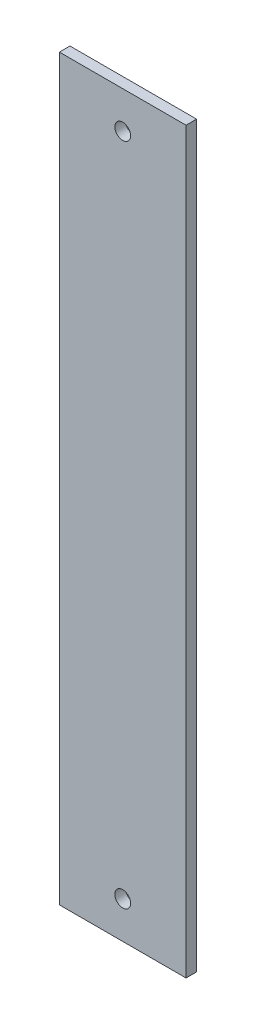
ISO-10303-21;
HEADER;
FILE_DESCRIPTION(('STEP AP214'),'2;1');
FILE_NAME('part.step','',(''),(''),'','','');
FILE_SCHEMA(('AUTOMOTIVE_DESIGN { 1 0 10303 214 1 1 1 1 }'));
ENDSEC;
DATA;
#1=APPLICATION_CONTEXT('core data for automotive mechanical design processes');
#2=APPLICATION_PROTOCOL_DEFINITION('international standard','automotive_design',2000,#1);
#3=PRODUCT_CONTEXT('',#1,'mechanical');
#4=PRODUCT('Part','Part','',(#3));
#5=PRODUCT_RELATED_PRODUCT_CATEGORY('part','',(#4));
#6=PRODUCT_DEFINITION_FORMATION('','',#4);
#7=PRODUCT_DEFINITION_CONTEXT('part definition',#1,'design');
#8=PRODUCT_DEFINITION('design','',#6,#7);
#9=PRODUCT_DEFINITION_SHAPE('','',#8);
#10=(LENGTH_UNIT() NAMED_UNIT(*) SI_UNIT(.MILLI.,.METRE.));
#11=(NAMED_UNIT(*) PLANE_ANGLE_UNIT() SI_UNIT($,.RADIAN.));
#12=(NAMED_UNIT(*) SI_UNIT($,.STERADIAN.) SOLID_ANGLE_UNIT());
#13=UNCERTAINTY_MEASURE_WITH_UNIT(LENGTH_MEASURE(1.E-05),#10,'distance_accuracy_value','');
#14=(GEOMETRIC_REPRESENTATION_CONTEXT(3) GLOBAL_UNCERTAINTY_ASSIGNED_CONTEXT((#13)) GLOBAL_UNIT_ASSIGNED_CONTEXT((#10,
#11,#12)) REPRESENTATION_CONTEXT('',''));
#15=CARTESIAN_POINT('',(0.,0.,0.));
#16=DIRECTION('',(0.,0.,1.));
#17=DIRECTION('',(1.,0.,0.));
#18=AXIS2_PLACEMENT_3D('',#15,#16,#17);
#19=CARTESIAN_POINT('',(0.,0.,2.));
#20=DIRECTION('',(0.,0.,-1.));
#21=DIRECTION('',(-1.,0.,0.));
#22=AXIS2_PLACEMENT_3D('',#19,#20,#21);
#23=PLANE('',#22);
#24=DIRECTION('',(0.,-1.,0.));
#25=VECTOR('',#24,1.);
#26=CARTESIAN_POINT('',(0.,0.,2.));
#27=LINE('',#26,#25);
#28=CARTESIAN_POINT('',(0.,140.,2.));
#29=VERTEX_POINT('',#28);
#30=CARTESIAN_POINT('',(0.,0.,2.));
#31=VERTEX_POINT('',#30);
#32=EDGE_CURVE('E87',#29,#31,#27,.T.);
#33=ORIENTED_EDGE('',*,*,#32,.T.);
#34=DIRECTION('',(1.,0.,0.));
#35=VECTOR('',#34,1.);
#36=CARTESIAN_POINT('',(0.,0.,2.));
#37=LINE('',#36,#35);
#38=CARTESIAN_POINT('',(24.,0.,2.));
#39=VERTEX_POINT('',#38);
#40=EDGE_CURVE('E82',#31,#39,#37,.T.);
#41=ORIENTED_EDGE('',*,*,#40,.T.);
#42=DIRECTION('',(0.,1.,0.));
#43=VECTOR('',#42,1.);
#44=CARTESIAN_POINT('',(24.,0.,2.));
#45=LINE('',#44,#43);
#46=CARTESIAN_POINT('',(24.,140.,2.));
#47=VERTEX_POINT('',#46);
#48=EDGE_CURVE('E85',#39,#47,#45,.T.);
#49=ORIENTED_EDGE('',*,*,#48,.T.);
#50=DIRECTION('',(-1.,0.,0.));
#51=VECTOR('',#50,1.);
#52=CARTESIAN_POINT('',(0.,140.,2.));
#53=LINE('',#52,#51);
#54=EDGE_CURVE('E52',#47,#29,#53,.T.);
#55=ORIENTED_EDGE('',*,*,#54,.T.);
#56=EDGE_LOOP('',(#33,#41,#49,#55));
#57=FACE_BOUND('',#56,.T.);
#58=CARTESIAN_POINT('',(12.,133.,2.));
#59=DIRECTION('',(0.,0.,1.));
#60=DIRECTION('',(1.,0.,0.));
#61=AXIS2_PLACEMENT_3D('',#58,#59,#60);
#62=CIRCLE('',#61,1.5);
#63=CARTESIAN_POINT('',(13.5,133.,2.));
#64=VERTEX_POINT('',#63);
#65=EDGE_CURVE('E102',#64,#64,#62,.T.);
#66=ORIENTED_EDGE('',*,*,#65,.F.);
#67=EDGE_LOOP('',(#66));
#68=FACE_BOUND('',#67,.T.);
#69=CARTESIAN_POINT('',(12.,7.,2.));
#70=DIRECTION('',(0.,0.,1.));
#71=DIRECTION('',(1.,0.,0.));
#72=AXIS2_PLACEMENT_3D('',#69,#70,#71);
#73=CIRCLE('',#72,1.5);
#74=CARTESIAN_POINT('',(13.5,7.,2.));
#75=VERTEX_POINT('',#74);
#76=EDGE_CURVE('E117',#75,#75,#73,.T.);
#77=ORIENTED_EDGE('',*,*,#76,.F.);
#78=EDGE_LOOP('',(#77));
#79=FACE_BOUND('',#78,.T.);
#80=ADVANCED_FACE('F35',(#57,#68,#79),#23,.F.);
#81=CARTESIAN_POINT('',(0.,0.,0.));
#82=DIRECTION('',(0.,0.,-1.));
#83=DIRECTION('',(-1.,0.,0.));
#84=AXIS2_PLACEMENT_3D('',#81,#82,#83);
#85=PLANE('',#84);
#86=CARTESIAN_POINT('',(12.,133.,0.));
#87=DIRECTION('',(0.,0.,1.));
#88=DIRECTION('',(1.,0.,0.));
#89=AXIS2_PLACEMENT_3D('',#86,#87,#88);
#90=CIRCLE('',#89,1.5);
#91=CARTESIAN_POINT('',(13.5,133.,0.));
#92=VERTEX_POINT('',#91);
#93=EDGE_CURVE('E114',#92,#92,#90,.T.);
#94=ORIENTED_EDGE('',*,*,#93,.T.);
#95=EDGE_LOOP('',(#94));
#96=FACE_BOUND('',#95,.T.);
#97=DIRECTION('',(0.,-1.,0.));
#98=VECTOR('',#97,1.);
#99=CARTESIAN_POINT('',(0.,0.,0.));
#100=LINE('',#99,#98);
#101=CARTESIAN_POINT('',(0.,140.,0.));
#102=VERTEX_POINT('',#101);
#103=CARTESIAN_POINT('',(0.,0.,0.));
#104=VERTEX_POINT('',#103);
#105=EDGE_CURVE('E99',#102,#104,#100,.T.);
#106=ORIENTED_EDGE('',*,*,#105,.F.);
#107=DIRECTION('',(-1.,0.,0.));
#108=VECTOR('',#107,1.);
#109=CARTESIAN_POINT('',(0.,140.,0.));
#110=LINE('',#109,#108);
#111=CARTESIAN_POINT('',(24.,140.,0.));
#112=VERTEX_POINT('',#111);
#113=EDGE_CURVE('E75',#112,#102,#110,.T.);
#114=ORIENTED_EDGE('',*,*,#113,.F.);
#115=DIRECTION('',(0.,1.,0.));
#116=VECTOR('',#115,1.);
#117=CARTESIAN_POINT('',(24.,0.,0.));
#118=LINE('',#117,#116);
#119=CARTESIAN_POINT('',(24.,0.,0.));
#120=VERTEX_POINT('',#119);
#121=EDGE_CURVE('E69',#120,#112,#118,.T.);
#122=ORIENTED_EDGE('',*,*,#121,.F.);
#123=DIRECTION('',(1.,0.,0.));
#124=VECTOR('',#123,1.);
#125=CARTESIAN_POINT('',(0.,0.,0.));
#126=LINE('',#125,#124);
#127=EDGE_CURVE('E91',#104,#120,#126,.T.);
#128=ORIENTED_EDGE('',*,*,#127,.F.);
#129=EDGE_LOOP('',(#106,#114,#122,#128));
#130=FACE_BOUND('',#129,.T.);
#131=CARTESIAN_POINT('',(12.,7.,0.));
#132=DIRECTION('',(0.,0.,1.));
#133=DIRECTION('',(1.,0.,0.));
#134=AXIS2_PLACEMENT_3D('',#131,#132,#133);
#135=CIRCLE('',#134,1.5);
#136=CARTESIAN_POINT('',(13.5,7.,0.));
#137=VERTEX_POINT('',#136);
#138=EDGE_CURVE('E120',#137,#137,#135,.T.);
#139=ORIENTED_EDGE('',*,*,#138,.T.);
#140=EDGE_LOOP('',(#139));
#141=FACE_BOUND('',#140,.T.);
#142=ADVANCED_FACE('F110',(#96,#130,#141),#85,.T.);
#143=CARTESIAN_POINT('',(0.,0.,2.));
#144=DIRECTION('',(1.,0.,0.));
#145=DIRECTION('',(0.,0.,-1.));
#146=AXIS2_PLACEMENT_3D('',#143,#144,#145);
#147=PLANE('',#146);
#148=ORIENTED_EDGE('',*,*,#105,.T.);
#149=DIRECTION('',(0.,0.,-1.));
#150=VECTOR('',#149,1.);
#151=CARTESIAN_POINT('',(0.,0.,2.));
#152=LINE('',#151,#150);
#153=EDGE_CURVE('E11',#31,#104,#152,.T.);
#154=ORIENTED_EDGE('',*,*,#153,.F.);
#155=ORIENTED_EDGE('',*,*,#32,.F.);
#156=DIRECTION('',(0.,0.,-1.));
#157=VECTOR('',#156,1.);
#158=CARTESIAN_POINT('',(0.,140.,2.));
#159=LINE('',#158,#157);
#160=EDGE_CURVE('E95',#29,#102,#159,.T.);
#161=ORIENTED_EDGE('',*,*,#160,.T.);
#162=EDGE_LOOP('',(#148,#154,#155,#161));
#163=FACE_BOUND('',#162,.T.);
#164=ADVANCED_FACE('F37',(#163),#147,.F.);
#165=CARTESIAN_POINT('',(0.,0.,2.));
#166=DIRECTION('',(0.,1.,0.));
#167=DIRECTION('',(-1.,0.,0.));
#168=AXIS2_PLACEMENT_3D('',#165,#166,#167);
#169=PLANE('',#168);
#170=ORIENTED_EDGE('',*,*,#127,.T.);
#171=DIRECTION('',(0.,0.,-1.));
#172=VECTOR('',#171,1.);
#173=CARTESIAN_POINT('',(24.,0.,2.));
#174=LINE('',#173,#172);
#175=EDGE_CURVE('E44',#39,#120,#174,.T.);
#176=ORIENTED_EDGE('',*,*,#175,.F.);
#177=ORIENTED_EDGE('',*,*,#40,.F.);
#178=ORIENTED_EDGE('',*,*,#153,.T.);
#179=EDGE_LOOP('',(#170,#176,#177,#178));
#180=FACE_BOUND('',#179,.T.);
#181=ADVANCED_FACE('F90',(#180),#169,.F.);
#182=CARTESIAN_POINT('',(24.,0.,2.));
#183=DIRECTION('',(-1.,0.,0.));
#184=DIRECTION('',(0.,-1.,0.));
#185=AXIS2_PLACEMENT_3D('',#182,#183,#184);
#186=PLANE('',#185);
#187=ORIENTED_EDGE('',*,*,#121,.T.);
#188=DIRECTION('',(0.,0.,-1.));
#189=VECTOR('',#188,1.);
#190=CARTESIAN_POINT('',(24.,140.,2.));
#191=LINE('',#190,#189);
#192=EDGE_CURVE('E92',#47,#112,#191,.T.);
#193=ORIENTED_EDGE('',*,*,#192,.F.);
#194=ORIENTED_EDGE('',*,*,#48,.F.);
#195=ORIENTED_EDGE('',*,*,#175,.T.);
#196=EDGE_LOOP('',(#187,#193,#194,#195));
#197=FACE_BOUND('',#196,.T.);
#198=ADVANCED_FACE('F93',(#197),#186,.F.);
#199=CARTESIAN_POINT('',(0.,140.,2.));
#200=DIRECTION('',(0.,-1.,0.));
#201=DIRECTION('',(0.,0.,-1.));
#202=AXIS2_PLACEMENT_3D('',#199,#200,#201);
#203=PLANE('',#202);
#204=ORIENTED_EDGE('',*,*,#113,.T.);
#205=ORIENTED_EDGE('',*,*,#160,.F.);
#206=ORIENTED_EDGE('',*,*,#54,.F.);
#207=ORIENTED_EDGE('',*,*,#192,.T.);
#208=EDGE_LOOP('',(#204,#205,#206,#207));
#209=FACE_BOUND('',#208,.T.);
#210=ADVANCED_FACE('F107',(#209),#203,.F.);
#211=CARTESIAN_POINT('',(12.,133.,2.));
#212=DIRECTION('',(0.,0.,-1.));
#213=DIRECTION('',(-1.,0.,0.));
#214=AXIS2_PLACEMENT_3D('',#211,#212,#213);
#215=CYLINDRICAL_SURFACE('',#214,1.5);
#216=ORIENTED_EDGE('',*,*,#65,.T.);
#217=EDGE_LOOP('',(#216));
#218=FACE_BOUND('',#217,.T.);
#219=ORIENTED_EDGE('',*,*,#93,.F.);
#220=EDGE_LOOP('',(#219));
#221=FACE_BOUND('',#220,.T.);
#222=ADVANCED_FACE('F137',(#218,#221),#215,.F.);
#223=CARTESIAN_POINT('',(12.,7.,2.));
#224=DIRECTION('',(0.,0.,-1.));
#225=DIRECTION('',(-1.,0.,0.));
#226=AXIS2_PLACEMENT_3D('',#223,#224,#225);
#227=CYLINDRICAL_SURFACE('',#226,1.5);
#228=ORIENTED_EDGE('',*,*,#76,.T.);
#229=EDGE_LOOP('',(#228));
#230=FACE_BOUND('',#229,.T.);
#231=ORIENTED_EDGE('',*,*,#138,.F.);
#232=EDGE_LOOP('',(#231));
#233=FACE_BOUND('',#232,.T.);
#234=ADVANCED_FACE('F126',(#230,#233),#227,.F.);
#235=CLOSED_SHELL('',(#80,#142,#164,#181,#198,#210,#222,#234));
#236=MANIFOLD_SOLID_BREP('B2',#235);
#237=ADVANCED_BREP_SHAPE_REPRESENTATION('',(#18,#236),#14);
#238=SHAPE_DEFINITION_REPRESENTATION(#9,#237);
ENDSEC;
END-ISO-10303-21;
